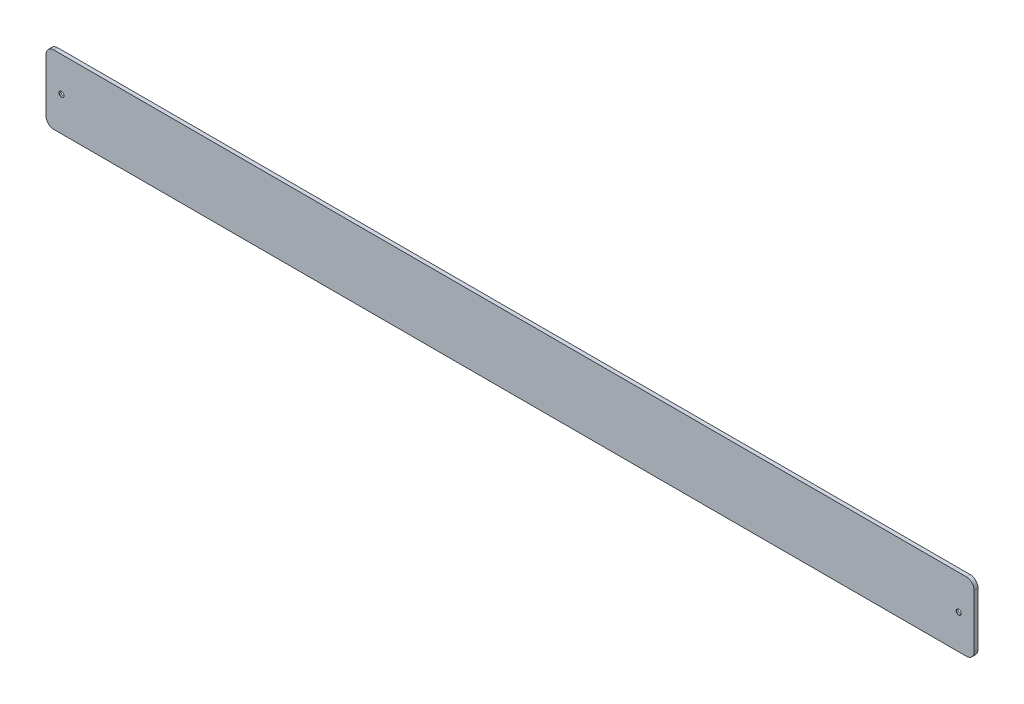
ISO-10303-21;
HEADER;
FILE_DESCRIPTION(('STEP AP214'),'2;1');
FILE_NAME('part.step','',(''),(''),'','','');
FILE_SCHEMA(('AUTOMOTIVE_DESIGN { 1 0 10303 214 1 1 1 1 }'));
ENDSEC;
DATA;
#1=APPLICATION_CONTEXT('core data for automotive mechanical design processes');
#2=APPLICATION_PROTOCOL_DEFINITION('international standard','automotive_design',2000,#1);
#3=PRODUCT_CONTEXT('',#1,'mechanical');
#4=PRODUCT('Part','Part','',(#3));
#5=PRODUCT_RELATED_PRODUCT_CATEGORY('part','',(#4));
#6=PRODUCT_DEFINITION_FORMATION('','',#4);
#7=PRODUCT_DEFINITION_CONTEXT('part definition',#1,'design');
#8=PRODUCT_DEFINITION('design','',#6,#7);
#9=PRODUCT_DEFINITION_SHAPE('','',#8);
#10=(LENGTH_UNIT() NAMED_UNIT(*) SI_UNIT(.MILLI.,.METRE.));
#11=(NAMED_UNIT(*) PLANE_ANGLE_UNIT() SI_UNIT($,.RADIAN.));
#12=(NAMED_UNIT(*) SI_UNIT($,.STERADIAN.) SOLID_ANGLE_UNIT());
#13=UNCERTAINTY_MEASURE_WITH_UNIT(LENGTH_MEASURE(1.E-05),#10,'distance_accuracy_value','');
#14=(GEOMETRIC_REPRESENTATION_CONTEXT(3) GLOBAL_UNCERTAINTY_ASSIGNED_CONTEXT((#13)) GLOBAL_UNIT_ASSIGNED_CONTEXT((#10,
#11,#12)) REPRESENTATION_CONTEXT('',''));
#15=CARTESIAN_POINT('',(0.,0.,0.));
#16=DIRECTION('',(0.,0.,1.));
#17=DIRECTION('',(1.,0.,0.));
#18=AXIS2_PLACEMENT_3D('',#15,#16,#17);
#19=CARTESIAN_POINT('',(-1067.28048387097,-34.5,0.));
#20=DIRECTION('',(0.,0.,-1.));
#21=DIRECTION('',(-1.,0.,0.));
#22=AXIS2_PLACEMENT_3D('',#19,#20,#21);
#23=PLANE('',#22);
#24=CARTESIAN_POINT('',(102.719516129032,-1.00613961606655E-13,0.));
#25=DIRECTION('',(0.,0.,-1.));
#26=DIRECTION('',(-1.,0.,0.));
#27=AXIS2_PLACEMENT_3D('',#24,#25,#26);
#28=CIRCLE('',#27,6.49999999999999);
#29=CARTESIAN_POINT('',(96.2195161290323,-1.00613961606655E-13,0.));
#30=VERTEX_POINT('',#29);
#31=EDGE_CURVE('E203',#30,#30,#28,.T.);
#32=ORIENTED_EDGE('',*,*,#31,.F.);
#33=EDGE_LOOP('',(#32));
#34=FACE_BOUND('',#33,.T.);
#35=CARTESIAN_POINT('',(-1057.28048387097,-0.176736788399245,0.));
#36=DIRECTION('',(0.,0.,-1.));
#37=DIRECTION('',(-1.,0.,0.));
#38=AXIS2_PLACEMENT_3D('',#35,#36,#37);
#39=CIRCLE('',#38,6.49999999999995);
#40=CARTESIAN_POINT('',(-1063.78048387097,-0.176736788399245,0.));
#41=VERTEX_POINT('',#40);
#42=EDGE_CURVE('E191',#41,#41,#39,.T.);
#43=ORIENTED_EDGE('',*,*,#42,.F.);
#44=EDGE_LOOP('',(#43));
#45=FACE_BOUND('',#44,.T.);
#46=CARTESIAN_POINT('',(-1067.28048387097,-34.5,0.));
#47=DIRECTION('',(0.,0.,1.));
#48=DIRECTION('',(-1.,0.,0.));
#49=AXIS2_PLACEMENT_3D('',#46,#47,#48);
#50=CIRCLE('',#49,10.);
#51=CARTESIAN_POINT('',(-1077.28048387097,-34.4999999999999,0.));
#52=VERTEX_POINT('',#51);
#53=CARTESIAN_POINT('',(-1067.28048387097,-44.5,0.));
#54=VERTEX_POINT('',#53);
#55=EDGE_CURVE('E130',#52,#54,#50,.T.);
#56=ORIENTED_EDGE('',*,*,#55,.F.);
#57=DIRECTION('',(0.,-1.,0.));
#58=VECTOR('',#57,1.);
#59=CARTESIAN_POINT('',(-1077.28048387097,-34.4999999999999,0.));
#60=LINE('',#59,#58);
#61=CARTESIAN_POINT('',(-1077.28048387097,34.4999999999999,0.));
#62=VERTEX_POINT('',#61);
#63=EDGE_CURVE('E85',#62,#52,#60,.T.);
#64=ORIENTED_EDGE('',*,*,#63,.F.);
#65=CARTESIAN_POINT('',(-1067.28048387097,34.5,0.));
#66=DIRECTION('',(0.,0.,1.));
#67=DIRECTION('',(-1.,0.,0.));
#68=AXIS2_PLACEMENT_3D('',#65,#66,#67);
#69=CIRCLE('',#68,10.);
#70=CARTESIAN_POINT('',(-1067.28048387097,44.5,0.));
#71=VERTEX_POINT('',#70);
#72=EDGE_CURVE('E79',#71,#62,#69,.T.);
#73=ORIENTED_EDGE('',*,*,#72,.F.);
#74=DIRECTION('',(-1.,0.,0.));
#75=VECTOR('',#74,1.);
#76=CARTESIAN_POINT('',(-1067.28048387097,44.5,0.));
#77=LINE('',#76,#75);
#78=CARTESIAN_POINT('',(112.719516129032,44.5,0.));
#79=VERTEX_POINT('',#78);
#80=EDGE_CURVE('E120',#79,#71,#77,.T.);
#81=ORIENTED_EDGE('',*,*,#80,.F.);
#82=CARTESIAN_POINT('',(112.719516129032,34.5,0.));
#83=DIRECTION('',(0.,0.,1.));
#84=DIRECTION('',(1.,0.,0.));
#85=AXIS2_PLACEMENT_3D('',#82,#83,#84);
#86=CIRCLE('',#85,10.);
#87=CARTESIAN_POINT('',(122.719516129032,34.4999999999999,0.));
#88=VERTEX_POINT('',#87);
#89=EDGE_CURVE('E140',#88,#79,#86,.T.);
#90=ORIENTED_EDGE('',*,*,#89,.F.);
#91=DIRECTION('',(0.,1.,0.));
#92=VECTOR('',#91,1.);
#93=CARTESIAN_POINT('',(122.719516129032,-34.4999999999999,0.));
#94=LINE('',#93,#92);
#95=CARTESIAN_POINT('',(122.719516129032,-34.4999999999999,0.));
#96=VERTEX_POINT('',#95);
#97=EDGE_CURVE('E138',#96,#88,#94,.T.);
#98=ORIENTED_EDGE('',*,*,#97,.F.);
#99=CARTESIAN_POINT('',(112.719516129032,-34.5,0.));
#100=DIRECTION('',(0.,0.,1.));
#101=DIRECTION('',(1.,0.,0.));
#102=AXIS2_PLACEMENT_3D('',#99,#100,#101);
#103=CIRCLE('',#102,10.);
#104=CARTESIAN_POINT('',(112.719516129032,-44.5,0.));
#105=VERTEX_POINT('',#104);
#106=EDGE_CURVE('E136',#105,#96,#103,.T.);
#107=ORIENTED_EDGE('',*,*,#106,.F.);
#108=DIRECTION('',(1.,0.,0.));
#109=VECTOR('',#108,1.);
#110=CARTESIAN_POINT('',(-1067.28048387097,-44.5,0.));
#111=LINE('',#110,#109);
#112=EDGE_CURVE('E133',#54,#105,#111,.T.);
#113=ORIENTED_EDGE('',*,*,#112,.F.);
#114=EDGE_LOOP('',(#56,#64,#73,#81,#90,#98,#107,#113));
#115=FACE_BOUND('',#114,.T.);
#116=ADVANCED_FACE('F33',(#34,#45,#115),#23,.T.);
#117=CARTESIAN_POINT('',(-1067.28048387097,-34.5,5.));
#118=DIRECTION('',(0.,0.,-1.));
#119=DIRECTION('',(-1.,0.,0.));
#120=AXIS2_PLACEMENT_3D('',#117,#118,#119);
#121=CYLINDRICAL_SURFACE('',#120,10.);
#122=ORIENTED_EDGE('',*,*,#55,.T.);
#123=DIRECTION('',(0.,0.,-1.));
#124=VECTOR('',#123,1.);
#125=CARTESIAN_POINT('',(-1067.28048387097,-44.5,5.));
#126=LINE('',#125,#124);
#127=CARTESIAN_POINT('',(-1067.28048387097,-44.5,5.));
#128=VERTEX_POINT('',#127);
#129=EDGE_CURVE('E11',#128,#54,#126,.T.);
#130=ORIENTED_EDGE('',*,*,#129,.F.);
#131=CARTESIAN_POINT('',(-1067.28048387097,-34.5,5.));
#132=DIRECTION('',(0.,0.,1.));
#133=DIRECTION('',(-1.,0.,0.));
#134=AXIS2_PLACEMENT_3D('',#131,#132,#133);
#135=CIRCLE('',#134,10.);
#136=CARTESIAN_POINT('',(-1077.28048387097,-34.4999999999999,5.));
#137=VERTEX_POINT('',#136);
#138=EDGE_CURVE('E145',#137,#128,#135,.T.);
#139=ORIENTED_EDGE('',*,*,#138,.F.);
#140=DIRECTION('',(0.,0.,-1.));
#141=VECTOR('',#140,1.);
#142=CARTESIAN_POINT('',(-1077.28048387097,-34.4999999999999,5.));
#143=LINE('',#142,#141);
#144=EDGE_CURVE('E126',#137,#52,#143,.T.);
#145=ORIENTED_EDGE('',*,*,#144,.T.);
#146=EDGE_LOOP('',(#122,#130,#139,#145));
#147=FACE_BOUND('',#146,.T.);
#148=ADVANCED_FACE('F35',(#147),#121,.T.);
#149=CARTESIAN_POINT('',(-1067.28048387097,-44.5,5.));
#150=DIRECTION('',(0.,1.,0.));
#151=DIRECTION('',(0.,0.,1.));
#152=AXIS2_PLACEMENT_3D('',#149,#150,#151);
#153=PLANE('',#152);
#154=ORIENTED_EDGE('',*,*,#112,.T.);
#155=DIRECTION('',(0.,0.,-1.));
#156=VECTOR('',#155,1.);
#157=CARTESIAN_POINT('',(112.719516129032,-44.5,5.));
#158=LINE('',#157,#156);
#159=CARTESIAN_POINT('',(112.719516129032,-44.5,5.));
#160=VERTEX_POINT('',#159);
#161=EDGE_CURVE('E42',#160,#105,#158,.T.);
#162=ORIENTED_EDGE('',*,*,#161,.F.);
#163=DIRECTION('',(1.,0.,0.));
#164=VECTOR('',#163,1.);
#165=CARTESIAN_POINT('',(-1067.28048387097,-44.5,5.));
#166=LINE('',#165,#164);
#167=EDGE_CURVE('E93',#128,#160,#166,.T.);
#168=ORIENTED_EDGE('',*,*,#167,.F.);
#169=ORIENTED_EDGE('',*,*,#129,.T.);
#170=EDGE_LOOP('',(#154,#162,#168,#169));
#171=FACE_BOUND('',#170,.T.);
#172=ADVANCED_FACE('F259',(#171),#153,.F.);
#173=CARTESIAN_POINT('',(112.719516129032,-34.5,5.));
#174=DIRECTION('',(0.,0.,-1.));
#175=DIRECTION('',(-1.,0.,0.));
#176=AXIS2_PLACEMENT_3D('',#173,#174,#175);
#177=CYLINDRICAL_SURFACE('',#176,10.);
#178=ORIENTED_EDGE('',*,*,#106,.T.);
#179=DIRECTION('',(0.,0.,-1.));
#180=VECTOR('',#179,1.);
#181=CARTESIAN_POINT('',(122.719516129032,-34.4999999999999,5.));
#182=LINE('',#181,#180);
#183=CARTESIAN_POINT('',(122.719516129032,-34.4999999999999,5.));
#184=VERTEX_POINT('',#183);
#185=EDGE_CURVE('E152',#184,#96,#182,.T.);
#186=ORIENTED_EDGE('',*,*,#185,.F.);
#187=CARTESIAN_POINT('',(112.719516129032,-34.5,5.));
#188=DIRECTION('',(0.,0.,1.));
#189=DIRECTION('',(1.,0.,0.));
#190=AXIS2_PLACEMENT_3D('',#187,#188,#189);
#191=CIRCLE('',#190,10.);
#192=EDGE_CURVE('E160',#160,#184,#191,.T.);
#193=ORIENTED_EDGE('',*,*,#192,.F.);
#194=ORIENTED_EDGE('',*,*,#161,.T.);
#195=EDGE_LOOP('',(#178,#186,#193,#194));
#196=FACE_BOUND('',#195,.T.);
#197=ADVANCED_FACE('F158',(#196),#177,.T.);
#198=CARTESIAN_POINT('',(122.719516129032,-34.4999999999999,5.));
#199=DIRECTION('',(-1.,0.,0.));
#200=DIRECTION('',(0.,0.,1.));
#201=AXIS2_PLACEMENT_3D('',#198,#199,#200);
#202=PLANE('',#201);
#203=ORIENTED_EDGE('',*,*,#97,.T.);
#204=DIRECTION('',(0.,0.,-1.));
#205=VECTOR('',#204,1.);
#206=CARTESIAN_POINT('',(122.719516129032,34.4999999999999,5.));
#207=LINE('',#206,#205);
#208=CARTESIAN_POINT('',(122.719516129032,34.4999999999999,5.));
#209=VERTEX_POINT('',#208);
#210=EDGE_CURVE('E149',#209,#88,#207,.T.);
#211=ORIENTED_EDGE('',*,*,#210,.F.);
#212=DIRECTION('',(0.,1.,0.));
#213=VECTOR('',#212,1.);
#214=CARTESIAN_POINT('',(122.719516129032,-34.4999999999999,5.));
#215=LINE('',#214,#213);
#216=EDGE_CURVE('E171',#184,#209,#215,.T.);
#217=ORIENTED_EDGE('',*,*,#216,.F.);
#218=ORIENTED_EDGE('',*,*,#185,.T.);
#219=EDGE_LOOP('',(#203,#211,#217,#218));
#220=FACE_BOUND('',#219,.T.);
#221=ADVANCED_FACE('F167',(#220),#202,.F.);
#222=CARTESIAN_POINT('',(112.719516129032,34.5,5.));
#223=DIRECTION('',(0.,0.,-1.));
#224=DIRECTION('',(-1.,0.,0.));
#225=AXIS2_PLACEMENT_3D('',#222,#223,#224);
#226=CYLINDRICAL_SURFACE('',#225,10.);
#227=ORIENTED_EDGE('',*,*,#89,.T.);
#228=DIRECTION('',(0.,0.,-1.));
#229=VECTOR('',#228,1.);
#230=CARTESIAN_POINT('',(112.719516129032,44.5,5.));
#231=LINE('',#230,#229);
#232=CARTESIAN_POINT('',(112.719516129032,44.5,5.));
#233=VERTEX_POINT('',#232);
#234=EDGE_CURVE('E121',#233,#79,#231,.T.);
#235=ORIENTED_EDGE('',*,*,#234,.F.);
#236=CARTESIAN_POINT('',(112.719516129032,34.5,5.));
#237=DIRECTION('',(0.,0.,1.));
#238=DIRECTION('',(1.,0.,0.));
#239=AXIS2_PLACEMENT_3D('',#236,#237,#238);
#240=CIRCLE('',#239,10.);
#241=EDGE_CURVE('E112',#209,#233,#240,.T.);
#242=ORIENTED_EDGE('',*,*,#241,.F.);
#243=ORIENTED_EDGE('',*,*,#210,.T.);
#244=EDGE_LOOP('',(#227,#235,#242,#243));
#245=FACE_BOUND('',#244,.T.);
#246=ADVANCED_FACE('F170',(#245),#226,.T.);
#247=CARTESIAN_POINT('',(-1067.28048387097,44.5,5.));
#248=DIRECTION('',(0.,-1.,0.));
#249=DIRECTION('',(0.,0.,-1.));
#250=AXIS2_PLACEMENT_3D('',#247,#248,#249);
#251=PLANE('',#250);
#252=ORIENTED_EDGE('',*,*,#80,.T.);
#253=DIRECTION('',(0.,0.,-1.));
#254=VECTOR('',#253,1.);
#255=CARTESIAN_POINT('',(-1067.28048387097,44.5,5.));
#256=LINE('',#255,#254);
#257=CARTESIAN_POINT('',(-1067.28048387097,44.5,5.));
#258=VERTEX_POINT('',#257);
#259=EDGE_CURVE('E117',#258,#71,#256,.T.);
#260=ORIENTED_EDGE('',*,*,#259,.F.);
#261=DIRECTION('',(-1.,0.,0.));
#262=VECTOR('',#261,1.);
#263=CARTESIAN_POINT('',(-1067.28048387097,44.5,5.));
#264=LINE('',#263,#262);
#265=EDGE_CURVE('E106',#233,#258,#264,.T.);
#266=ORIENTED_EDGE('',*,*,#265,.F.);
#267=ORIENTED_EDGE('',*,*,#234,.T.);
#268=EDGE_LOOP('',(#252,#260,#266,#267));
#269=FACE_BOUND('',#268,.T.);
#270=ADVANCED_FACE('F118',(#269),#251,.F.);
#271=CARTESIAN_POINT('',(-1067.28048387097,34.5,5.));
#272=DIRECTION('',(0.,0.,-1.));
#273=DIRECTION('',(-1.,0.,0.));
#274=AXIS2_PLACEMENT_3D('',#271,#272,#273);
#275=CYLINDRICAL_SURFACE('',#274,10.);
#276=ORIENTED_EDGE('',*,*,#72,.T.);
#277=DIRECTION('',(0.,0.,-1.));
#278=VECTOR('',#277,1.);
#279=CARTESIAN_POINT('',(-1077.28048387097,34.4999999999999,5.));
#280=LINE('',#279,#278);
#281=CARTESIAN_POINT('',(-1077.28048387097,34.4999999999999,5.));
#282=VERTEX_POINT('',#281);
#283=EDGE_CURVE('E122',#282,#62,#280,.T.);
#284=ORIENTED_EDGE('',*,*,#283,.F.);
#285=CARTESIAN_POINT('',(-1067.28048387097,34.5,5.));
#286=DIRECTION('',(0.,0.,1.));
#287=DIRECTION('',(-1.,0.,0.));
#288=AXIS2_PLACEMENT_3D('',#285,#286,#287);
#289=CIRCLE('',#288,10.);
#290=EDGE_CURVE('E110',#258,#282,#289,.T.);
#291=ORIENTED_EDGE('',*,*,#290,.F.);
#292=ORIENTED_EDGE('',*,*,#259,.T.);
#293=EDGE_LOOP('',(#276,#284,#291,#292));
#294=FACE_BOUND('',#293,.T.);
#295=ADVANCED_FACE('F124',(#294),#275,.T.);
#296=CARTESIAN_POINT('',(-1077.28048387097,-34.4999999999999,5.));
#297=DIRECTION('',(1.,0.,0.));
#298=DIRECTION('',(0.,0.,-1.));
#299=AXIS2_PLACEMENT_3D('',#296,#297,#298);
#300=PLANE('',#299);
#301=ORIENTED_EDGE('',*,*,#63,.T.);
#302=ORIENTED_EDGE('',*,*,#144,.F.);
#303=DIRECTION('',(0.,-1.,0.));
#304=VECTOR('',#303,1.);
#305=CARTESIAN_POINT('',(-1077.28048387097,-34.4999999999999,5.));
#306=LINE('',#305,#304);
#307=EDGE_CURVE('E50',#282,#137,#306,.T.);
#308=ORIENTED_EDGE('',*,*,#307,.F.);
#309=ORIENTED_EDGE('',*,*,#283,.T.);
#310=EDGE_LOOP('',(#301,#302,#308,#309));
#311=FACE_BOUND('',#310,.T.);
#312=ADVANCED_FACE('F245',(#311),#300,.F.);
#313=CARTESIAN_POINT('',(-1067.28048387097,-34.5,5.));
#314=DIRECTION('',(0.,0.,-1.));
#315=DIRECTION('',(-1.,0.,0.));
#316=AXIS2_PLACEMENT_3D('',#313,#314,#315);
#317=PLANE('',#316);
#318=CARTESIAN_POINT('',(-1057.28048387097,-0.176736788399245,5.));
#319=DIRECTION('',(0.,0.,1.));
#320=DIRECTION('',(1.,0.,0.));
#321=AXIS2_PLACEMENT_3D('',#318,#319,#320);
#322=CIRCLE('',#321,3.30000000000008);
#323=CARTESIAN_POINT('',(-1053.98048387097,-0.176736788399245,5.));
#324=VERTEX_POINT('',#323);
#325=EDGE_CURVE('E179',#324,#324,#322,.T.);
#326=ORIENTED_EDGE('',*,*,#325,.F.);
#327=EDGE_LOOP('',(#326));
#328=FACE_BOUND('',#327,.T.);
#329=CARTESIAN_POINT('',(102.719516129032,-1.00613961606655E-13,5.));
#330=DIRECTION('',(0.,0.,1.));
#331=DIRECTION('',(1.,0.,0.));
#332=AXIS2_PLACEMENT_3D('',#329,#330,#331);
#333=CIRCLE('',#332,3.29999999999998);
#334=CARTESIAN_POINT('',(106.019516129032,-1.00613961606655E-13,5.));
#335=VERTEX_POINT('',#334);
#336=EDGE_CURVE('E134',#335,#335,#333,.T.);
#337=ORIENTED_EDGE('',*,*,#336,.F.);
#338=EDGE_LOOP('',(#337));
#339=FACE_BOUND('',#338,.T.);
#340=ORIENTED_EDGE('',*,*,#138,.T.);
#341=ORIENTED_EDGE('',*,*,#167,.T.);
#342=ORIENTED_EDGE('',*,*,#192,.T.);
#343=ORIENTED_EDGE('',*,*,#216,.T.);
#344=ORIENTED_EDGE('',*,*,#241,.T.);
#345=ORIENTED_EDGE('',*,*,#265,.T.);
#346=ORIENTED_EDGE('',*,*,#290,.T.);
#347=ORIENTED_EDGE('',*,*,#307,.T.);
#348=EDGE_LOOP('',(#340,#341,#342,#343,#344,#345,#346,#347));
#349=FACE_BOUND('',#348,.T.);
#350=ADVANCED_FACE('F108',(#328,#339,#349),#317,.F.);
#351=CARTESIAN_POINT('',(102.719516129032,-1.00613961606655E-13,5.));
#352=DIRECTION('',(0.,0.,1.));
#353=DIRECTION('',(1.,0.,0.));
#354=AXIS2_PLACEMENT_3D('',#351,#352,#353);
#355=CYLINDRICAL_SURFACE('',#354,3.29999999999999);
#356=CARTESIAN_POINT('',(102.719516129032,-1.00613961606655E-13,4.62500000000001));
#357=DIRECTION('',(0.,0.,-1.));
#358=DIRECTION('',(-1.,0.,0.));
#359=AXIS2_PLACEMENT_3D('',#356,#357,#358);
#360=CIRCLE('',#359,3.3);
#361=CARTESIAN_POINT('',(99.4195161290323,-1.00613961606655E-13,4.62500000000001));
#362=VERTEX_POINT('',#361);
#363=EDGE_CURVE('E194',#362,#362,#360,.T.);
#364=ORIENTED_EDGE('',*,*,#363,.T.);
#365=EDGE_LOOP('',(#364));
#366=FACE_BOUND('',#365,.T.);
#367=ORIENTED_EDGE('',*,*,#336,.T.);
#368=EDGE_LOOP('',(#367));
#369=FACE_BOUND('',#368,.T.);
#370=ADVANCED_FACE('F239',(#366,#369),#355,.F.);
#371=CARTESIAN_POINT('',(-1057.28048387097,-0.176736788399245,5.));
#372=DIRECTION('',(0.,0.,1.));
#373=DIRECTION('',(1.,0.,0.));
#374=AXIS2_PLACEMENT_3D('',#371,#372,#373);
#375=CYLINDRICAL_SURFACE('',#374,3.30000000000008);
#376=CARTESIAN_POINT('',(-1057.28048387097,-0.176736788399245,4.62500000000001));
#377=DIRECTION('',(0.,0.,-1.));
#378=DIRECTION('',(-1.,0.,0.));
#379=AXIS2_PLACEMENT_3D('',#376,#377,#378);
#380=CIRCLE('',#379,3.30000000000008);
#381=CARTESIAN_POINT('',(-1060.58048387097,-0.176736788399245,4.62500000000001));
#382=VERTEX_POINT('',#381);
#383=EDGE_CURVE('E182',#382,#382,#380,.T.);
#384=ORIENTED_EDGE('',*,*,#383,.T.);
#385=EDGE_LOOP('',(#384));
#386=FACE_BOUND('',#385,.T.);
#387=ORIENTED_EDGE('',*,*,#325,.T.);
#388=EDGE_LOOP('',(#387));
#389=FACE_BOUND('',#388,.T.);
#390=ADVANCED_FACE('F235',(#386,#389),#375,.F.);
#391=CARTESIAN_POINT('',(-1057.28048387097,-0.176736788399245,4.6));
#392=DIRECTION('',(0.,0.,-1.));
#393=DIRECTION('',(-1.,0.,0.));
#394=AXIS2_PLACEMENT_3D('',#391,#392,#393);
#395=CONICAL_SURFACE('',#394,3.32500000000002,0.785398163396043);
#396=ORIENTED_EDGE('',*,*,#383,.F.);
#397=EDGE_LOOP('',(#396));
#398=FACE_BOUND('',#397,.T.);
#399=CARTESIAN_POINT('',(-1057.28048387097,-0.176736788399245,4.6));
#400=DIRECTION('',(0.,0.,-1.));
#401=DIRECTION('',(-1.,0.,0.));
#402=AXIS2_PLACEMENT_3D('',#399,#400,#401);
#403=CIRCLE('',#402,3.32500000000002);
#404=CARTESIAN_POINT('',(-1060.60548387097,-0.176736788399245,4.6));
#405=VERTEX_POINT('',#404);
#406=EDGE_CURVE('E185',#405,#405,#403,.T.);
#407=ORIENTED_EDGE('',*,*,#406,.T.);
#408=EDGE_LOOP('',(#407));
#409=FACE_BOUND('',#408,.T.);
#410=ADVANCED_FACE('F227',(#398,#409),#395,.F.);
#411=CARTESIAN_POINT('',(-1053.95548387097,-0.176736788399245,4.6));
#412=DIRECTION('',(0.,0.,1.));
#413=DIRECTION('',(1.,0.,0.));
#414=AXIS2_PLACEMENT_3D('',#411,#412,#413);
#415=PLANE('',#414);
#416=ORIENTED_EDGE('',*,*,#406,.F.);
#417=EDGE_LOOP('',(#416));
#418=FACE_BOUND('',#417,.T.);
#419=CARTESIAN_POINT('',(-1057.28048387097,-0.176736788399245,4.6));
#420=DIRECTION('',(0.,0.,-1.));
#421=DIRECTION('',(-1.,0.,0.));
#422=AXIS2_PLACEMENT_3D('',#419,#420,#421);
#423=CIRCLE('',#422,6.49999999999995);
#424=CARTESIAN_POINT('',(-1063.78048387097,-0.176736788399245,4.6));
#425=VERTEX_POINT('',#424);
#426=EDGE_CURVE('E188',#425,#425,#423,.T.);
#427=ORIENTED_EDGE('',*,*,#426,.T.);
#428=EDGE_LOOP('',(#427));
#429=FACE_BOUND('',#428,.T.);
#430=ADVANCED_FACE('F217',(#418,#429),#415,.F.);
#431=CARTESIAN_POINT('',(-1057.28048387097,-0.176736788399245,0.));
#432=DIRECTION('',(0.,0.,-1.));
#433=DIRECTION('',(-1.,0.,0.));
#434=AXIS2_PLACEMENT_3D('',#431,#432,#433);
#435=CYLINDRICAL_SURFACE('',#434,6.49999999999995);
#436=ORIENTED_EDGE('',*,*,#426,.F.);
#437=EDGE_LOOP('',(#436));
#438=FACE_BOUND('',#437,.T.);
#439=ORIENTED_EDGE('',*,*,#42,.T.);
#440=EDGE_LOOP('',(#439));
#441=FACE_BOUND('',#440,.T.);
#442=ADVANCED_FACE('F214',(#438,#441),#435,.F.);
#443=CARTESIAN_POINT('',(102.719516129032,-1.00613961606655E-13,4.6));
#444=DIRECTION('',(0.,0.,-1.));
#445=DIRECTION('',(-1.,0.,0.));
#446=AXIS2_PLACEMENT_3D('',#443,#444,#445);
#447=CONICAL_SURFACE('',#446,3.32499999999999,0.785398163397153);
#448=ORIENTED_EDGE('',*,*,#363,.F.);
#449=EDGE_LOOP('',(#448));
#450=FACE_BOUND('',#449,.T.);
#451=CARTESIAN_POINT('',(102.719516129032,-1.00613961606655E-13,4.6));
#452=DIRECTION('',(0.,0.,-1.));
#453=DIRECTION('',(-1.,0.,0.));
#454=AXIS2_PLACEMENT_3D('',#451,#452,#453);
#455=CIRCLE('',#454,3.32499999999999);
#456=CARTESIAN_POINT('',(99.3945161290323,-1.00613961606655E-13,4.6));
#457=VERTEX_POINT('',#456);
#458=EDGE_CURVE('E197',#457,#457,#455,.T.);
#459=ORIENTED_EDGE('',*,*,#458,.T.);
#460=EDGE_LOOP('',(#459));
#461=FACE_BOUND('',#460,.T.);
#462=ADVANCED_FACE('F216',(#450,#461),#447,.F.);
#463=CARTESIAN_POINT('',(106.044516129032,-1.00613961606655E-13,4.6));
#464=DIRECTION('',(0.,0.,1.));
#465=DIRECTION('',(1.,0.,0.));
#466=AXIS2_PLACEMENT_3D('',#463,#464,#465);
#467=PLANE('',#466);
#468=ORIENTED_EDGE('',*,*,#458,.F.);
#469=EDGE_LOOP('',(#468));
#470=FACE_BOUND('',#469,.T.);
#471=CARTESIAN_POINT('',(102.719516129032,-1.00613961606655E-13,4.6));
#472=DIRECTION('',(0.,0.,-1.));
#473=DIRECTION('',(-1.,0.,0.));
#474=AXIS2_PLACEMENT_3D('',#471,#472,#473);
#475=CIRCLE('',#474,6.49999999999999);
#476=CARTESIAN_POINT('',(96.2195161290323,-1.00613961606655E-13,4.6));
#477=VERTEX_POINT('',#476);
#478=EDGE_CURVE('E200',#477,#477,#475,.T.);
#479=ORIENTED_EDGE('',*,*,#478,.T.);
#480=EDGE_LOOP('',(#479));
#481=FACE_BOUND('',#480,.T.);
#482=ADVANCED_FACE('F224',(#470,#481),#467,.F.);
#483=CARTESIAN_POINT('',(102.719516129032,-1.00613961606655E-13,0.));
#484=DIRECTION('',(0.,0.,-1.));
#485=DIRECTION('',(-1.,0.,0.));
#486=AXIS2_PLACEMENT_3D('',#483,#484,#485);
#487=CYLINDRICAL_SURFACE('',#486,6.49999999999999);
#488=ORIENTED_EDGE('',*,*,#478,.F.);
#489=EDGE_LOOP('',(#488));
#490=FACE_BOUND('',#489,.T.);
#491=ORIENTED_EDGE('',*,*,#31,.T.);
#492=EDGE_LOOP('',(#491));
#493=FACE_BOUND('',#492,.T.);
#494=ADVANCED_FACE('F207',(#490,#493),#487,.F.);
#495=CLOSED_SHELL('',(#116,#148,#172,#197,#221,#246,#270,#295,#312,#350,#370,#390,#410,#430,
#442,#462,#482,#494));
#496=MANIFOLD_SOLID_BREP('B2',#495);
#497=ADVANCED_BREP_SHAPE_REPRESENTATION('',(#18,#496),#14);
#498=SHAPE_DEFINITION_REPRESENTATION(#9,#497);
ENDSEC;
END-ISO-10303-21;
